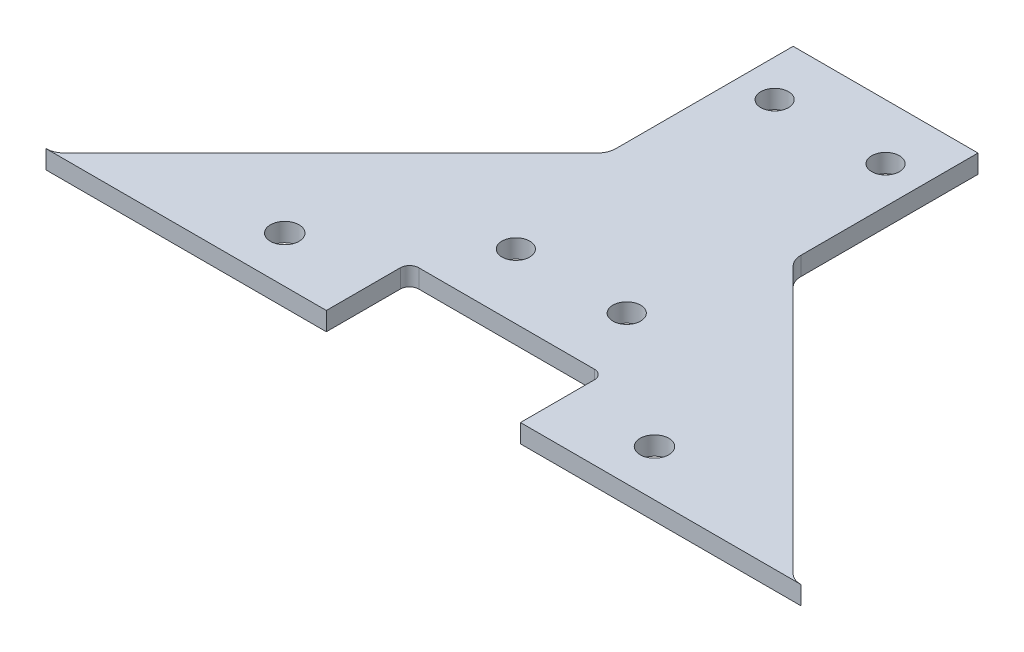
ISO-10303-21;
HEADER;
FILE_DESCRIPTION(('STEP AP214'),'2;1');
FILE_NAME('part.step','',(''),(''),'','','');
FILE_SCHEMA(('AUTOMOTIVE_DESIGN { 1 0 10303 214 1 1 1 1 }'));
ENDSEC;
DATA;
#1=APPLICATION_CONTEXT('core data for automotive mechanical design processes');
#2=APPLICATION_PROTOCOL_DEFINITION('international standard','automotive_design',2000,#1);
#3=PRODUCT_CONTEXT('',#1,'mechanical');
#4=PRODUCT('Part','Part','',(#3));
#5=PRODUCT_RELATED_PRODUCT_CATEGORY('part','',(#4));
#6=PRODUCT_DEFINITION_FORMATION('','',#4);
#7=PRODUCT_DEFINITION_CONTEXT('part definition',#1,'design');
#8=PRODUCT_DEFINITION('design','',#6,#7);
#9=PRODUCT_DEFINITION_SHAPE('','',#8);
#10=(LENGTH_UNIT() NAMED_UNIT(*) SI_UNIT(.MILLI.,.METRE.));
#11=(NAMED_UNIT(*) PLANE_ANGLE_UNIT() SI_UNIT($,.RADIAN.));
#12=(NAMED_UNIT(*) SI_UNIT($,.STERADIAN.) SOLID_ANGLE_UNIT());
#13=UNCERTAINTY_MEASURE_WITH_UNIT(LENGTH_MEASURE(1.E-05),#10,'distance_accuracy_value','');
#14=(GEOMETRIC_REPRESENTATION_CONTEXT(3) GLOBAL_UNCERTAINTY_ASSIGNED_CONTEXT((#13)) GLOBAL_UNIT_ASSIGNED_CONTEXT((#10,
#11,#12)) REPRESENTATION_CONTEXT('',''));
#15=CARTESIAN_POINT('',(0.,0.,0.));
#16=DIRECTION('',(0.,0.,1.));
#17=DIRECTION('',(1.,0.,0.));
#18=AXIS2_PLACEMENT_3D('',#15,#16,#17);
#19=CARTESIAN_POINT('',(0.,0.,50.));
#20=DIRECTION('',(0.,0.,-1.));
#21=DIRECTION('',(-1.,0.,0.));
#22=AXIS2_PLACEMENT_3D('',#19,#20,#21);
#23=PLANE('',#22);
#24=DIRECTION('',(-1.,0.,0.));
#25=VECTOR('',#24,1.);
#26=CARTESIAN_POINT('',(0.,0.,50.));
#27=LINE('',#26,#25);
#28=CARTESIAN_POINT('',(40.8284271247462,0.,50.));
#29=VERTEX_POINT('',#28);
#30=CARTESIAN_POINT('',(10.5,0.,50.));
#31=VERTEX_POINT('',#30);
#32=EDGE_CURVE('E161',#29,#31,#27,.T.);
#33=ORIENTED_EDGE('',*,*,#32,.F.);
#34=DIRECTION('',(0.,-1.,0.));
#35=VECTOR('',#34,1.);
#36=CARTESIAN_POINT('',(40.8284271247462,2.,50.));
#37=LINE('',#36,#35);
#38=CARTESIAN_POINT('',(40.8284271247462,2.,50.));
#39=VERTEX_POINT('',#38);
#40=EDGE_CURVE('E52',#29,#39,#37,.F.);
#41=ORIENTED_EDGE('',*,*,#40,.T.);
#42=DIRECTION('',(-1.,0.,0.));
#43=VECTOR('',#42,1.);
#44=CARTESIAN_POINT('',(0.,2.,50.));
#45=LINE('',#44,#43);
#46=CARTESIAN_POINT('',(10.5,2.,50.));
#47=VERTEX_POINT('',#46);
#48=EDGE_CURVE('E163',#39,#47,#45,.T.);
#49=ORIENTED_EDGE('',*,*,#48,.T.);
#50=DIRECTION('',(0.,1.,0.));
#51=VECTOR('',#50,1.);
#52=CARTESIAN_POINT('',(10.5,0.,50.));
#53=LINE('',#52,#51);
#54=EDGE_CURVE('E158',#31,#47,#53,.T.);
#55=ORIENTED_EDGE('',*,*,#54,.F.);
#56=EDGE_LOOP('',(#33,#41,#49,#55));
#57=FACE_BOUND('',#56,.T.);
#58=ADVANCED_FACE('F43',(#57),#23,.F.);
#59=DIRECTION('',(0.,1.,0.));
#60=VECTOR('',#59,1.);
#61=CARTESIAN_POINT('',(-10.5,0.,50.));
#62=LINE('',#61,#60);
#63=CARTESIAN_POINT('',(-10.5,0.,50.));
#64=VERTEX_POINT('',#63);
#65=CARTESIAN_POINT('',(-10.5,2.,50.));
#66=VERTEX_POINT('',#65);
#67=EDGE_CURVE('E11',#64,#66,#62,.T.);
#68=ORIENTED_EDGE('',*,*,#67,.T.);
#69=CARTESIAN_POINT('',(-40.8284271247462,2.,50.));
#70=VERTEX_POINT('',#69);
#71=EDGE_CURVE('E47',#66,#70,#45,.T.);
#72=ORIENTED_EDGE('',*,*,#71,.T.);
#73=DIRECTION('',(0.,-1.,0.));
#74=VECTOR('',#73,1.);
#75=CARTESIAN_POINT('',(-40.8284271247462,0.,50.));
#76=LINE('',#75,#74);
#77=CARTESIAN_POINT('',(-40.8284271247462,0.,50.));
#78=VERTEX_POINT('',#77);
#79=EDGE_CURVE('E281',#70,#78,#76,.T.);
#80=ORIENTED_EDGE('',*,*,#79,.T.);
#81=EDGE_CURVE('E65',#64,#78,#27,.T.);
#82=ORIENTED_EDGE('',*,*,#81,.F.);
#83=EDGE_LOOP('',(#68,#72,#80,#82));
#84=FACE_BOUND('',#83,.T.);
#85=ADVANCED_FACE('F45',(#84),#23,.F.);
#86=CARTESIAN_POINT('',(6.,0.,6.));
#87=DIRECTION('',(0.,1.,0.));
#88=DIRECTION('',(0.,0.,1.));
#89=AXIS2_PLACEMENT_3D('',#86,#87,#88);
#90=CYLINDRICAL_SURFACE('',#89,1.5);
#91=CARTESIAN_POINT('',(6.,0.,6.));
#92=DIRECTION('',(0.,1.,0.));
#93=DIRECTION('',(0.,0.,-1.));
#94=AXIS2_PLACEMENT_3D('',#91,#92,#93);
#95=CIRCLE('',#94,1.5);
#96=CARTESIAN_POINT('',(6.,0.,4.5));
#97=VERTEX_POINT('',#96);
#98=EDGE_CURVE('E219',#97,#97,#95,.T.);
#99=ORIENTED_EDGE('',*,*,#98,.F.);
#100=EDGE_LOOP('',(#99));
#101=FACE_BOUND('',#100,.T.);
#102=CARTESIAN_POINT('',(6.,2.,6.));
#103=DIRECTION('',(0.,1.,0.));
#104=DIRECTION('',(0.,0.,-1.));
#105=AXIS2_PLACEMENT_3D('',#102,#103,#104);
#106=CIRCLE('',#105,1.5);
#107=CARTESIAN_POINT('',(6.,2.,4.5));
#108=VERTEX_POINT('',#107);
#109=EDGE_CURVE('E213',#108,#108,#106,.T.);
#110=ORIENTED_EDGE('',*,*,#109,.T.);
#111=EDGE_LOOP('',(#110));
#112=FACE_BOUND('',#111,.T.);
#113=ADVANCED_FACE('F364',(#101,#112),#90,.F.);
#114=CARTESIAN_POINT('',(6.00000000000001,0.,34.));
#115=DIRECTION('',(0.,1.,0.));
#116=DIRECTION('',(0.,0.,1.));
#117=AXIS2_PLACEMENT_3D('',#114,#115,#116);
#118=CYLINDRICAL_SURFACE('',#117,1.5);
#119=CARTESIAN_POINT('',(6.00000000000001,0.,34.));
#120=DIRECTION('',(0.,1.,0.));
#121=DIRECTION('',(0.,0.,-1.));
#122=AXIS2_PLACEMENT_3D('',#119,#120,#121);
#123=CIRCLE('',#122,1.5);
#124=CARTESIAN_POINT('',(6.00000000000001,0.,32.5));
#125=VERTEX_POINT('',#124);
#126=EDGE_CURVE('E232',#125,#125,#123,.T.);
#127=ORIENTED_EDGE('',*,*,#126,.F.);
#128=EDGE_LOOP('',(#127));
#129=FACE_BOUND('',#128,.T.);
#130=CARTESIAN_POINT('',(6.00000000000001,2.,34.));
#131=DIRECTION('',(0.,1.,0.));
#132=DIRECTION('',(0.,0.,-1.));
#133=AXIS2_PLACEMENT_3D('',#130,#131,#132);
#134=CIRCLE('',#133,1.5);
#135=CARTESIAN_POINT('',(6.00000000000001,2.,32.5));
#136=VERTEX_POINT('',#135);
#137=EDGE_CURVE('E222',#136,#136,#134,.T.);
#138=ORIENTED_EDGE('',*,*,#137,.T.);
#139=EDGE_LOOP('',(#138));
#140=FACE_BOUND('',#139,.T.);
#141=ADVANCED_FACE('F369',(#129,#140),#118,.F.);
#142=CARTESIAN_POINT('',(-6.,0.,34.));
#143=DIRECTION('',(0.,1.,0.));
#144=DIRECTION('',(0.,0.,1.));
#145=AXIS2_PLACEMENT_3D('',#142,#143,#144);
#146=CYLINDRICAL_SURFACE('',#145,1.5);
#147=CARTESIAN_POINT('',(-6.,0.,34.));
#148=DIRECTION('',(0.,1.,0.));
#149=DIRECTION('',(0.,0.,1.));
#150=AXIS2_PLACEMENT_3D('',#147,#148,#149);
#151=CIRCLE('',#150,1.5);
#152=CARTESIAN_POINT('',(-6.,0.,35.5));
#153=VERTEX_POINT('',#152);
#154=EDGE_CURVE('E225',#153,#153,#151,.T.);
#155=ORIENTED_EDGE('',*,*,#154,.F.);
#156=EDGE_LOOP('',(#155));
#157=FACE_BOUND('',#156,.T.);
#158=CARTESIAN_POINT('',(-6.,2.,34.));
#159=DIRECTION('',(0.,1.,0.));
#160=DIRECTION('',(0.,0.,1.));
#161=AXIS2_PLACEMENT_3D('',#158,#159,#160);
#162=CIRCLE('',#161,1.5);
#163=CARTESIAN_POINT('',(-6.,2.,35.5));
#164=VERTEX_POINT('',#163);
#165=EDGE_CURVE('E229',#164,#164,#162,.T.);
#166=ORIENTED_EDGE('',*,*,#165,.T.);
#167=EDGE_LOOP('',(#166));
#168=FACE_BOUND('',#167,.T.);
#169=ADVANCED_FACE('F395',(#157,#168),#146,.F.);
#170=CARTESIAN_POINT('',(12.,2.,19.1715728752541));
#171=DIRECTION('',(0.,1.,0.));
#172=DIRECTION('',(0.,0.,1.));
#173=AXIS2_PLACEMENT_3D('',#170,#171,#172);
#174=CYLINDRICAL_SURFACE('',#173,2.);
#175=CARTESIAN_POINT('',(12.,2.,19.1715728752541));
#176=DIRECTION('',(0.,1.,0.));
#177=DIRECTION('',(0.,0.,1.));
#178=AXIS2_PLACEMENT_3D('',#175,#176,#177);
#179=CIRCLE('',#178,2.);
#180=CARTESIAN_POINT('',(10.5857864376269,2.,20.5857864376272));
#181=VERTEX_POINT('',#180);
#182=CARTESIAN_POINT('',(10.,2.,19.1715728752541));
#183=VERTEX_POINT('',#182);
#184=EDGE_CURVE('E297',#181,#183,#179,.F.);
#185=ORIENTED_EDGE('',*,*,#184,.F.);
#186=DIRECTION('',(0.,-1.,0.));
#187=VECTOR('',#186,1.);
#188=CARTESIAN_POINT('',(10.5857864376269,2.,20.5857864376272));
#189=LINE('',#188,#187);
#190=CARTESIAN_POINT('',(10.5857864376269,0.,20.5857864376272));
#191=VERTEX_POINT('',#190);
#192=EDGE_CURVE('E274',#191,#181,#189,.F.);
#193=ORIENTED_EDGE('',*,*,#192,.F.);
#194=CARTESIAN_POINT('',(12.,0.,19.1715728752541));
#195=DIRECTION('',(0.,1.,0.));
#196=DIRECTION('',(0.,0.,1.));
#197=AXIS2_PLACEMENT_3D('',#194,#195,#196);
#198=CIRCLE('',#197,2.);
#199=CARTESIAN_POINT('',(10.,0.,19.1715728752541));
#200=VERTEX_POINT('',#199);
#201=EDGE_CURVE('E295',#200,#191,#198,.T.);
#202=ORIENTED_EDGE('',*,*,#201,.F.);
#203=DIRECTION('',(0.,-1.,0.));
#204=VECTOR('',#203,1.);
#205=CARTESIAN_POINT('',(10.,0.,19.1715728752541));
#206=LINE('',#205,#204);
#207=EDGE_CURVE('E279',#183,#200,#206,.T.);
#208=ORIENTED_EDGE('',*,*,#207,.F.);
#209=EDGE_LOOP('',(#185,#193,#202,#208));
#210=FACE_BOUND('',#209,.T.);
#211=ADVANCED_FACE('F340',(#210),#174,.F.);
#212=CARTESIAN_POINT('',(10.,2.,0.));
#213=DIRECTION('',(-1.,0.,0.));
#214=DIRECTION('',(0.,0.,1.));
#215=AXIS2_PLACEMENT_3D('',#212,#213,#214);
#216=PLANE('',#215);
#217=DIRECTION('',(0.,0.,-1.));
#218=VECTOR('',#217,1.);
#219=CARTESIAN_POINT('',(10.,2.,0.));
#220=LINE('',#219,#218);
#221=CARTESIAN_POINT('',(10.,2.,0.));
#222=VERTEX_POINT('',#221);
#223=EDGE_CURVE('E246',#183,#222,#220,.T.);
#224=ORIENTED_EDGE('',*,*,#223,.F.);
#225=ORIENTED_EDGE('',*,*,#207,.T.);
#226=DIRECTION('',(0.,0.,-1.));
#227=VECTOR('',#226,1.);
#228=CARTESIAN_POINT('',(10.,0.,0.));
#229=LINE('',#228,#227);
#230=CARTESIAN_POINT('',(10.,0.,0.));
#231=VERTEX_POINT('',#230);
#232=EDGE_CURVE('E260',#200,#231,#229,.T.);
#233=ORIENTED_EDGE('',*,*,#232,.T.);
#234=DIRECTION('',(0.,-1.,0.));
#235=VECTOR('',#234,1.);
#236=CARTESIAN_POINT('',(10.,2.,0.));
#237=LINE('',#236,#235);
#238=EDGE_CURVE('E271',#222,#231,#237,.T.);
#239=ORIENTED_EDGE('',*,*,#238,.F.);
#240=EDGE_LOOP('',(#224,#225,#233,#239));
#241=FACE_BOUND('',#240,.T.);
#242=ADVANCED_FACE('F336',(#241),#216,.F.);
#243=CARTESIAN_POINT('',(10.,2.,0.));
#244=DIRECTION('',(0.,0.,1.));
#245=DIRECTION('',(1.,0.,0.));
#246=AXIS2_PLACEMENT_3D('',#243,#244,#245);
#247=PLANE('',#246);
#248=DIRECTION('',(-1.,0.,0.));
#249=VECTOR('',#248,1.);
#250=CARTESIAN_POINT('',(10.,0.,0.));
#251=LINE('',#250,#249);
#252=CARTESIAN_POINT('',(-10.,0.,0.));
#253=VERTEX_POINT('',#252);
#254=EDGE_CURVE('E262',#231,#253,#251,.T.);
#255=ORIENTED_EDGE('',*,*,#254,.T.);
#256=DIRECTION('',(0.,-1.,0.));
#257=VECTOR('',#256,1.);
#258=CARTESIAN_POINT('',(-10.,2.,0.));
#259=LINE('',#258,#257);
#260=CARTESIAN_POINT('',(-10.,2.,0.));
#261=VERTEX_POINT('',#260);
#262=EDGE_CURVE('E257',#261,#253,#259,.T.);
#263=ORIENTED_EDGE('',*,*,#262,.F.);
#264=DIRECTION('',(-1.,0.,0.));
#265=VECTOR('',#264,1.);
#266=CARTESIAN_POINT('',(10.,2.,0.));
#267=LINE('',#266,#265);
#268=EDGE_CURVE('E249',#222,#261,#267,.T.);
#269=ORIENTED_EDGE('',*,*,#268,.F.);
#270=ORIENTED_EDGE('',*,*,#238,.T.);
#271=EDGE_LOOP('',(#255,#263,#269,#270));
#272=FACE_BOUND('',#271,.T.);
#273=ADVANCED_FACE('F331',(#272),#247,.F.);
#274=CARTESIAN_POINT('',(-10.,2.,0.));
#275=DIRECTION('',(1.,0.,0.));
#276=DIRECTION('',(0.,0.,-1.));
#277=AXIS2_PLACEMENT_3D('',#274,#275,#276);
#278=PLANE('',#277);
#279=DIRECTION('',(0.,0.,1.));
#280=VECTOR('',#279,1.);
#281=CARTESIAN_POINT('',(-10.,0.,0.));
#282=LINE('',#281,#280);
#283=CARTESIAN_POINT('',(-10.,0.,19.1715728752541));
#284=VERTEX_POINT('',#283);
#285=EDGE_CURVE('E264',#253,#284,#282,.T.);
#286=ORIENTED_EDGE('',*,*,#285,.T.);
#287=DIRECTION('',(0.,-1.,0.));
#288=VECTOR('',#287,1.);
#289=CARTESIAN_POINT('',(-10.,2.,19.1715728752541));
#290=LINE('',#289,#288);
#291=CARTESIAN_POINT('',(-10.,2.,19.1715728752541));
#292=VERTEX_POINT('',#291);
#293=EDGE_CURVE('E289',#284,#292,#290,.F.);
#294=ORIENTED_EDGE('',*,*,#293,.T.);
#295=DIRECTION('',(0.,0.,1.));
#296=VECTOR('',#295,1.);
#297=CARTESIAN_POINT('',(-10.,2.,0.));
#298=LINE('',#297,#296);
#299=EDGE_CURVE('E251',#261,#292,#298,.T.);
#300=ORIENTED_EDGE('',*,*,#299,.F.);
#301=ORIENTED_EDGE('',*,*,#262,.T.);
#302=EDGE_LOOP('',(#286,#294,#300,#301));
#303=FACE_BOUND('',#302,.T.);
#304=ADVANCED_FACE('F327',(#303),#278,.F.);
#305=CARTESIAN_POINT('',(-12.,2.,19.1715728752541));
#306=DIRECTION('',(0.,1.,0.));
#307=DIRECTION('',(0.,0.,1.));
#308=AXIS2_PLACEMENT_3D('',#305,#306,#307);
#309=CYLINDRICAL_SURFACE('',#308,2.);
#310=CARTESIAN_POINT('',(-12.,2.,19.1715728752541));
#311=DIRECTION('',(0.,1.,0.));
#312=DIRECTION('',(0.,0.,1.));
#313=AXIS2_PLACEMENT_3D('',#310,#311,#312);
#314=CIRCLE('',#313,2.);
#315=CARTESIAN_POINT('',(-10.5857864376269,2.,20.5857864376272));
#316=VERTEX_POINT('',#315);
#317=EDGE_CURVE('E301',#292,#316,#314,.F.);
#318=ORIENTED_EDGE('',*,*,#317,.F.);
#319=ORIENTED_EDGE('',*,*,#293,.F.);
#320=CARTESIAN_POINT('',(-12.,0.,19.1715728752541));
#321=DIRECTION('',(0.,1.,0.));
#322=DIRECTION('',(0.,0.,1.));
#323=AXIS2_PLACEMENT_3D('',#320,#321,#322);
#324=CIRCLE('',#323,2.);
#325=CARTESIAN_POINT('',(-10.5857864376269,0.,20.5857864376272));
#326=VERTEX_POINT('',#325);
#327=EDGE_CURVE('E299',#326,#284,#324,.T.);
#328=ORIENTED_EDGE('',*,*,#327,.F.);
#329=DIRECTION('',(0.,-1.,0.));
#330=VECTOR('',#329,1.);
#331=CARTESIAN_POINT('',(-10.5857864376269,0.,20.5857864376272));
#332=LINE('',#331,#330);
#333=EDGE_CURVE('E286',#316,#326,#332,.T.);
#334=ORIENTED_EDGE('',*,*,#333,.F.);
#335=EDGE_LOOP('',(#318,#319,#328,#334));
#336=FACE_BOUND('',#335,.T.);
#337=ADVANCED_FACE('F323',(#336),#309,.F.);
#338=CARTESIAN_POINT('',(-9.5,0.,41.));
#339=DIRECTION('',(0.,0.,-1.));
#340=DIRECTION('',(-1.,0.,0.));
#341=AXIS2_PLACEMENT_3D('',#338,#339,#340);
#342=PLANE('',#341);
#343=DIRECTION('',(-1.,0.,0.));
#344=VECTOR('',#343,1.);
#345=CARTESIAN_POINT('',(-9.5,2.,41.));
#346=LINE('',#345,#344);
#347=CARTESIAN_POINT('',(9.49999999999999,2.,41.));
#348=VERTEX_POINT('',#347);
#349=CARTESIAN_POINT('',(-9.50000000000001,2.,41.));
#350=VERTEX_POINT('',#349);
#351=EDGE_CURVE('E206',#348,#350,#346,.T.);
#352=ORIENTED_EDGE('',*,*,#351,.T.);
#353=DIRECTION('',(0.,1.,0.));
#354=VECTOR('',#353,1.);
#355=CARTESIAN_POINT('',(-9.50000000000001,0.,41.));
#356=LINE('',#355,#354);
#357=CARTESIAN_POINT('',(-9.50000000000001,0.,41.));
#358=VERTEX_POINT('',#357);
#359=EDGE_CURVE('E214',#358,#350,#356,.T.);
#360=ORIENTED_EDGE('',*,*,#359,.F.);
#361=DIRECTION('',(-1.,0.,0.));
#362=VECTOR('',#361,1.);
#363=CARTESIAN_POINT('',(-9.5,0.,41.));
#364=LINE('',#363,#362);
#365=CARTESIAN_POINT('',(9.49999999999999,0.,41.));
#366=VERTEX_POINT('',#365);
#367=EDGE_CURVE('E184',#366,#358,#364,.T.);
#368=ORIENTED_EDGE('',*,*,#367,.F.);
#369=DIRECTION('',(0.,1.,0.));
#370=VECTOR('',#369,1.);
#371=CARTESIAN_POINT('',(9.49999999999999,0.,41.));
#372=LINE('',#371,#370);
#373=EDGE_CURVE('E216',#366,#348,#372,.T.);
#374=ORIENTED_EDGE('',*,*,#373,.T.);
#375=EDGE_LOOP('',(#352,#360,#368,#374));
#376=FACE_BOUND('',#375,.T.);
#377=ADVANCED_FACE('F387',(#376),#342,.F.);
#378=CARTESIAN_POINT('',(-6.,0.,6.));
#379=DIRECTION('',(0.,1.,0.));
#380=DIRECTION('',(0.,0.,1.));
#381=AXIS2_PLACEMENT_3D('',#378,#379,#380);
#382=CYLINDRICAL_SURFACE('',#381,1.5);
#383=CARTESIAN_POINT('',(-6.,0.,6.));
#384=DIRECTION('',(0.,1.,0.));
#385=DIRECTION('',(0.,0.,1.));
#386=AXIS2_PLACEMENT_3D('',#383,#384,#385);
#387=CIRCLE('',#386,1.5);
#388=CARTESIAN_POINT('',(-6.,0.,7.5));
#389=VERTEX_POINT('',#388);
#390=EDGE_CURVE('E237',#389,#389,#387,.T.);
#391=ORIENTED_EDGE('',*,*,#390,.F.);
#392=EDGE_LOOP('',(#391));
#393=FACE_BOUND('',#392,.T.);
#394=CARTESIAN_POINT('',(-6.,2.,6.));
#395=DIRECTION('',(0.,1.,0.));
#396=DIRECTION('',(0.,0.,1.));
#397=AXIS2_PLACEMENT_3D('',#394,#395,#396);
#398=CIRCLE('',#397,1.5);
#399=CARTESIAN_POINT('',(-6.,2.,7.5));
#400=VERTEX_POINT('',#399);
#401=EDGE_CURVE('E228',#400,#400,#398,.T.);
#402=ORIENTED_EDGE('',*,*,#401,.T.);
#403=EDGE_LOOP('',(#402));
#404=FACE_BOUND('',#403,.T.);
#405=ADVANCED_FACE('F390',(#393,#404),#382,.F.);
#406=CARTESIAN_POINT('',(20.,0.,45.));
#407=DIRECTION('',(0.,1.,0.));
#408=DIRECTION('',(0.,0.,1.));
#409=AXIS2_PLACEMENT_3D('',#406,#407,#408);
#410=CYLINDRICAL_SURFACE('',#409,1.55);
#411=CARTESIAN_POINT('',(20.,0.,45.));
#412=DIRECTION('',(0.,1.,0.));
#413=DIRECTION('',(0.,0.,-1.));
#414=AXIS2_PLACEMENT_3D('',#411,#412,#413);
#415=CIRCLE('',#414,1.55);
#416=CARTESIAN_POINT('',(20.,0.,43.45));
#417=VERTEX_POINT('',#416);
#418=EDGE_CURVE('E565',#417,#417,#415,.T.);
#419=ORIENTED_EDGE('',*,*,#418,.F.);
#420=EDGE_LOOP('',(#419));
#421=FACE_BOUND('',#420,.T.);
#422=CARTESIAN_POINT('',(20.,2.,45.));
#423=DIRECTION('',(0.,1.,0.));
#424=DIRECTION('',(0.,0.,-1.));
#425=AXIS2_PLACEMENT_3D('',#422,#423,#424);
#426=CIRCLE('',#425,1.55);
#427=CARTESIAN_POINT('',(20.,2.,43.45));
#428=VERTEX_POINT('',#427);
#429=EDGE_CURVE('E190',#428,#428,#426,.T.);
#430=ORIENTED_EDGE('',*,*,#429,.T.);
#431=EDGE_LOOP('',(#430));
#432=FACE_BOUND('',#431,.T.);
#433=ADVANCED_FACE('F379',(#421,#432),#410,.F.);
#434=CARTESIAN_POINT('',(-20.,0.,45.));
#435=DIRECTION('',(0.,1.,0.));
#436=DIRECTION('',(0.,0.,1.));
#437=AXIS2_PLACEMENT_3D('',#434,#435,#436);
#438=CYLINDRICAL_SURFACE('',#437,1.55);
#439=CARTESIAN_POINT('',(-20.,0.,45.));
#440=DIRECTION('',(0.,1.,0.));
#441=DIRECTION('',(0.,0.,1.));
#442=AXIS2_PLACEMENT_3D('',#439,#440,#441);
#443=CIRCLE('',#442,1.55);
#444=CARTESIAN_POINT('',(-20.,0.,46.55));
#445=VERTEX_POINT('',#444);
#446=EDGE_CURVE('E203',#445,#445,#443,.T.);
#447=ORIENTED_EDGE('',*,*,#446,.F.);
#448=EDGE_LOOP('',(#447));
#449=FACE_BOUND('',#448,.T.);
#450=CARTESIAN_POINT('',(-20.,2.,45.));
#451=DIRECTION('',(0.,1.,0.));
#452=DIRECTION('',(0.,0.,1.));
#453=AXIS2_PLACEMENT_3D('',#450,#451,#452);
#454=CIRCLE('',#453,1.55);
#455=CARTESIAN_POINT('',(-20.,2.,46.55));
#456=VERTEX_POINT('',#455);
#457=EDGE_CURVE('E564',#456,#456,#454,.T.);
#458=ORIENTED_EDGE('',*,*,#457,.T.);
#459=EDGE_LOOP('',(#458));
#460=FACE_BOUND('',#459,.T.);
#461=ADVANCED_FACE('F385',(#449,#460),#438,.F.);
#462=CARTESIAN_POINT('',(-9.50000000000001,0.,42.));
#463=DIRECTION('',(0.,1.,0.));
#464=DIRECTION('',(0.,0.,1.));
#465=AXIS2_PLACEMENT_3D('',#462,#463,#464);
#466=CYLINDRICAL_SURFACE('',#465,1.);
#467=CARTESIAN_POINT('',(-9.50000000000001,2.,42.));
#468=DIRECTION('',(0.,1.,0.));
#469=DIRECTION('',(0.,0.,-1.));
#470=AXIS2_PLACEMENT_3D('',#467,#468,#469);
#471=CIRCLE('',#470,1.);
#472=CARTESIAN_POINT('',(-10.5,2.,42.));
#473=VERTEX_POINT('',#472);
#474=EDGE_CURVE('E187',#350,#473,#471,.T.);
#475=ORIENTED_EDGE('',*,*,#474,.T.);
#476=DIRECTION('',(0.,1.,0.));
#477=VECTOR('',#476,1.);
#478=CARTESIAN_POINT('',(-10.5,0.,42.));
#479=LINE('',#478,#477);
#480=CARTESIAN_POINT('',(-10.5,0.,42.));
#481=VERTEX_POINT('',#480);
#482=EDGE_CURVE('E211',#481,#473,#479,.T.);
#483=ORIENTED_EDGE('',*,*,#482,.F.);
#484=CARTESIAN_POINT('',(-9.50000000000001,0.,42.));
#485=DIRECTION('',(0.,1.,0.));
#486=DIRECTION('',(0.,0.,-1.));
#487=AXIS2_PLACEMENT_3D('',#484,#485,#486);
#488=CIRCLE('',#487,1.);
#489=EDGE_CURVE('E195',#358,#481,#488,.T.);
#490=ORIENTED_EDGE('',*,*,#489,.F.);
#491=ORIENTED_EDGE('',*,*,#359,.T.);
#492=EDGE_LOOP('',(#475,#483,#490,#491));
#493=FACE_BOUND('',#492,.T.);
#494=ADVANCED_FACE('F381',(#493),#466,.F.);
#495=CARTESIAN_POINT('',(9.5,0.,42.));
#496=DIRECTION('',(0.,1.,0.));
#497=DIRECTION('',(0.,0.,1.));
#498=AXIS2_PLACEMENT_3D('',#495,#496,#497);
#499=CYLINDRICAL_SURFACE('',#498,1.);
#500=CARTESIAN_POINT('',(9.5,2.,42.));
#501=DIRECTION('',(0.,1.,0.));
#502=DIRECTION('',(0.,0.,-1.));
#503=AXIS2_PLACEMENT_3D('',#500,#501,#502);
#504=CIRCLE('',#503,1.);
#505=CARTESIAN_POINT('',(10.5,2.,42.));
#506=VERTEX_POINT('',#505);
#507=EDGE_CURVE('E202',#506,#348,#504,.T.);
#508=ORIENTED_EDGE('',*,*,#507,.T.);
#509=ORIENTED_EDGE('',*,*,#373,.F.);
#510=CARTESIAN_POINT('',(9.5,0.,42.));
#511=DIRECTION('',(0.,1.,0.));
#512=DIRECTION('',(0.,0.,-1.));
#513=AXIS2_PLACEMENT_3D('',#510,#511,#512);
#514=CIRCLE('',#513,1.);
#515=CARTESIAN_POINT('',(10.5,0.,42.));
#516=VERTEX_POINT('',#515);
#517=EDGE_CURVE('E181',#516,#366,#514,.T.);
#518=ORIENTED_EDGE('',*,*,#517,.F.);
#519=DIRECTION('',(0.,1.,0.));
#520=VECTOR('',#519,1.);
#521=CARTESIAN_POINT('',(10.5,0.,42.));
#522=LINE('',#521,#520);
#523=EDGE_CURVE('E168',#516,#506,#522,.T.);
#524=ORIENTED_EDGE('',*,*,#523,.T.);
#525=EDGE_LOOP('',(#508,#509,#518,#524));
#526=FACE_BOUND('',#525,.T.);
#527=ADVANCED_FACE('F384',(#526),#499,.F.);
#528=CARTESIAN_POINT('',(10.,2.,20.0000000000003));
#529=DIRECTION('',(-0.707106781186544,0.,0.707106781186551));
#530=DIRECTION('',(0.707106781186551,0.,0.707106781186544));
#531=AXIS2_PLACEMENT_3D('',#528,#529,#530);
#532=PLANE('',#531);
#533=DIRECTION('',(-0.707106781186551,0.,-0.707106781186544));
#534=VECTOR('',#533,1.);
#535=CARTESIAN_POINT('',(10.,2.,20.0000000000003));
#536=LINE('',#535,#534);
#537=CARTESIAN_POINT('',(39.4142135623731,2.,49.4142135623731));
#538=VERTEX_POINT('',#537);
#539=EDGE_CURVE('E243',#538,#181,#536,.T.);
#540=ORIENTED_EDGE('',*,*,#539,.F.);
#541=DIRECTION('',(0.,-1.,0.));
#542=VECTOR('',#541,1.);
#543=CARTESIAN_POINT('',(39.4142135623731,0.,49.4142135623731));
#544=LINE('',#543,#542);
#545=CARTESIAN_POINT('',(39.4142135623731,0.,49.4142135623731));
#546=VERTEX_POINT('',#545);
#547=EDGE_CURVE('E276',#538,#546,#544,.T.);
#548=ORIENTED_EDGE('',*,*,#547,.T.);
#549=DIRECTION('',(-0.707106781186551,0.,-0.707106781186544));
#550=VECTOR('',#549,1.);
#551=CARTESIAN_POINT('',(10.,0.,20.0000000000003));
#552=LINE('',#551,#550);
#553=EDGE_CURVE('E240',#546,#191,#552,.T.);
#554=ORIENTED_EDGE('',*,*,#553,.T.);
#555=ORIENTED_EDGE('',*,*,#192,.T.);
#556=EDGE_LOOP('',(#540,#548,#554,#555));
#557=FACE_BOUND('',#556,.T.);
#558=ADVANCED_FACE('F344',(#557),#532,.F.);
#559=CARTESIAN_POINT('',(0.,0.,0.));
#560=DIRECTION('',(0.,1.,0.));
#561=DIRECTION('',(0.,0.,1.));
#562=AXIS2_PLACEMENT_3D('',#559,#560,#561);
#563=PLANE('',#562);
#564=ORIENTED_EDGE('',*,*,#446,.T.);
#565=EDGE_LOOP('',(#564));
#566=FACE_BOUND('',#565,.T.);
#567=ORIENTED_EDGE('',*,*,#418,.T.);
#568=EDGE_LOOP('',(#567));
#569=FACE_BOUND('',#568,.T.);
#570=ORIENTED_EDGE('',*,*,#390,.T.);
#571=EDGE_LOOP('',(#570));
#572=FACE_BOUND('',#571,.T.);
#573=CARTESIAN_POINT('',(40.8284271247462,0.,48.));
#574=DIRECTION('',(0.,1.,0.));
#575=DIRECTION('',(0.,0.,1.));
#576=AXIS2_PLACEMENT_3D('',#573,#574,#575);
#577=CIRCLE('',#576,2.);
#578=EDGE_CURVE('E178',#546,#29,#577,.T.);
#579=ORIENTED_EDGE('',*,*,#578,.T.);
#580=ORIENTED_EDGE('',*,*,#32,.T.);
#581=DIRECTION('',(0.,0.,-1.));
#582=VECTOR('',#581,1.);
#583=CARTESIAN_POINT('',(10.5,0.,50.));
#584=LINE('',#583,#582);
#585=EDGE_CURVE('E176',#31,#516,#584,.T.);
#586=ORIENTED_EDGE('',*,*,#585,.T.);
#587=ORIENTED_EDGE('',*,*,#517,.T.);
#588=ORIENTED_EDGE('',*,*,#367,.T.);
#589=ORIENTED_EDGE('',*,*,#489,.T.);
#590=DIRECTION('',(0.,0.,1.));
#591=VECTOR('',#590,1.);
#592=CARTESIAN_POINT('',(-10.5,0.,50.));
#593=LINE('',#592,#591);
#594=EDGE_CURVE('E169',#481,#64,#593,.T.);
#595=ORIENTED_EDGE('',*,*,#594,.T.);
#596=ORIENTED_EDGE('',*,*,#81,.T.);
#597=CARTESIAN_POINT('',(-40.8284271247462,0.,48.));
#598=DIRECTION('',(0.,1.,0.));
#599=DIRECTION('',(0.,0.,1.));
#600=AXIS2_PLACEMENT_3D('',#597,#598,#599);
#601=CIRCLE('',#600,2.);
#602=CARTESIAN_POINT('',(-39.4142135623731,0.,49.4142135623731));
#603=VERTEX_POINT('',#602);
#604=EDGE_CURVE('E303',#78,#603,#601,.T.);
#605=ORIENTED_EDGE('',*,*,#604,.T.);
#606=DIRECTION('',(-0.707106781186551,0.,0.707106781186544));
#607=VECTOR('',#606,1.);
#608=CARTESIAN_POINT('',(-10.,0.,20.0000000000003));
#609=LINE('',#608,#607);
#610=EDGE_CURVE('E247',#326,#603,#609,.T.);
#611=ORIENTED_EDGE('',*,*,#610,.F.);
#612=ORIENTED_EDGE('',*,*,#327,.T.);
#613=ORIENTED_EDGE('',*,*,#285,.F.);
#614=ORIENTED_EDGE('',*,*,#254,.F.);
#615=ORIENTED_EDGE('',*,*,#232,.F.);
#616=ORIENTED_EDGE('',*,*,#201,.T.);
#617=ORIENTED_EDGE('',*,*,#553,.F.);
#618=EDGE_LOOP('',(#579,#580,#586,#587,#588,#589,#595,#596,#605,#611,#612,#613,#614,#615,#616,#617));
#619=FACE_BOUND('',#618,.T.);
#620=ORIENTED_EDGE('',*,*,#154,.T.);
#621=EDGE_LOOP('',(#620));
#622=FACE_BOUND('',#621,.T.);
#623=ORIENTED_EDGE('',*,*,#126,.T.);
#624=EDGE_LOOP('',(#623));
#625=FACE_BOUND('',#624,.T.);
#626=ORIENTED_EDGE('',*,*,#98,.T.);
#627=EDGE_LOOP('',(#626));
#628=FACE_BOUND('',#627,.T.);
#629=ADVANCED_FACE('F173',(#566,#569,#572,#619,#622,#625,#628),#563,.F.);
#630=CARTESIAN_POINT('',(-10.,2.,20.0000000000003));
#631=DIRECTION('',(0.707106781186544,0.,0.707106781186551));
#632=DIRECTION('',(0.707106781186551,0.,-0.707106781186544));
#633=AXIS2_PLACEMENT_3D('',#630,#631,#632);
#634=PLANE('',#633);
#635=DIRECTION('',(-0.707106781186551,0.,0.707106781186544));
#636=VECTOR('',#635,1.);
#637=CARTESIAN_POINT('',(-10.,2.,20.0000000000003));
#638=LINE('',#637,#636);
#639=CARTESIAN_POINT('',(-39.4142135623731,2.,49.4142135623731));
#640=VERTEX_POINT('',#639);
#641=EDGE_CURVE('E254',#316,#640,#638,.T.);
#642=ORIENTED_EDGE('',*,*,#641,.F.);
#643=ORIENTED_EDGE('',*,*,#333,.T.);
#644=ORIENTED_EDGE('',*,*,#610,.T.);
#645=DIRECTION('',(0.,-1.,0.));
#646=VECTOR('',#645,1.);
#647=CARTESIAN_POINT('',(-39.4142135623731,2.,49.4142135623731));
#648=LINE('',#647,#646);
#649=EDGE_CURVE('E284',#603,#640,#648,.F.);
#650=ORIENTED_EDGE('',*,*,#649,.T.);
#651=EDGE_LOOP('',(#642,#643,#644,#650));
#652=FACE_BOUND('',#651,.T.);
#653=ADVANCED_FACE('F315',(#652),#634,.F.);
#654=CARTESIAN_POINT('',(0.,2.,0.));
#655=DIRECTION('',(0.,1.,0.));
#656=DIRECTION('',(0.,0.,1.));
#657=AXIS2_PLACEMENT_3D('',#654,#655,#656);
#658=PLANE('',#657);
#659=ORIENTED_EDGE('',*,*,#48,.F.);
#660=CARTESIAN_POINT('',(40.8284271247462,2.,48.));
#661=DIRECTION('',(0.,1.,0.));
#662=DIRECTION('',(0.,0.,1.));
#663=AXIS2_PLACEMENT_3D('',#660,#661,#662);
#664=CIRCLE('',#663,2.);
#665=EDGE_CURVE('E293',#39,#538,#664,.F.);
#666=ORIENTED_EDGE('',*,*,#665,.T.);
#667=ORIENTED_EDGE('',*,*,#539,.T.);
#668=ORIENTED_EDGE('',*,*,#184,.T.);
#669=ORIENTED_EDGE('',*,*,#223,.T.);
#670=ORIENTED_EDGE('',*,*,#268,.T.);
#671=ORIENTED_EDGE('',*,*,#299,.T.);
#672=ORIENTED_EDGE('',*,*,#317,.T.);
#673=ORIENTED_EDGE('',*,*,#641,.T.);
#674=CARTESIAN_POINT('',(-40.8284271247462,2.,48.));
#675=DIRECTION('',(0.,1.,0.));
#676=DIRECTION('',(0.,0.,1.));
#677=AXIS2_PLACEMENT_3D('',#674,#675,#676);
#678=CIRCLE('',#677,2.);
#679=EDGE_CURVE('E305',#640,#70,#678,.F.);
#680=ORIENTED_EDGE('',*,*,#679,.T.);
#681=ORIENTED_EDGE('',*,*,#71,.F.);
#682=DIRECTION('',(0.,0.,1.));
#683=VECTOR('',#682,1.);
#684=CARTESIAN_POINT('',(-10.5,2.,50.));
#685=LINE('',#684,#683);
#686=EDGE_CURVE('E182',#473,#66,#685,.T.);
#687=ORIENTED_EDGE('',*,*,#686,.F.);
#688=ORIENTED_EDGE('',*,*,#474,.F.);
#689=ORIENTED_EDGE('',*,*,#351,.F.);
#690=ORIENTED_EDGE('',*,*,#507,.F.);
#691=DIRECTION('',(0.,0.,-1.));
#692=VECTOR('',#691,1.);
#693=CARTESIAN_POINT('',(10.5,2.,50.));
#694=LINE('',#693,#692);
#695=EDGE_CURVE('E200',#47,#506,#694,.T.);
#696=ORIENTED_EDGE('',*,*,#695,.F.);
#697=EDGE_LOOP('',(#659,#666,#667,#668,#669,#670,#671,#672,#673,#680,#681,#687,#688,#689,#690,#696));
#698=FACE_BOUND('',#697,.T.);
#699=ORIENTED_EDGE('',*,*,#457,.F.);
#700=EDGE_LOOP('',(#699));
#701=FACE_BOUND('',#700,.T.);
#702=ORIENTED_EDGE('',*,*,#429,.F.);
#703=EDGE_LOOP('',(#702));
#704=FACE_BOUND('',#703,.T.);
#705=ORIENTED_EDGE('',*,*,#401,.F.);
#706=EDGE_LOOP('',(#705));
#707=FACE_BOUND('',#706,.T.);
#708=ORIENTED_EDGE('',*,*,#165,.F.);
#709=EDGE_LOOP('',(#708));
#710=FACE_BOUND('',#709,.T.);
#711=ORIENTED_EDGE('',*,*,#137,.F.);
#712=EDGE_LOOP('',(#711));
#713=FACE_BOUND('',#712,.T.);
#714=ORIENTED_EDGE('',*,*,#109,.F.);
#715=EDGE_LOOP('',(#714));
#716=FACE_BOUND('',#715,.T.);
#717=ADVANCED_FACE('F317',(#698,#701,#704,#707,#710,#713,#716),#658,.T.);
#718=CARTESIAN_POINT('',(-40.8284271247462,2.,48.));
#719=DIRECTION('',(0.,1.,0.));
#720=DIRECTION('',(0.,0.,1.));
#721=AXIS2_PLACEMENT_3D('',#718,#719,#720);
#722=CYLINDRICAL_SURFACE('',#721,2.);
#723=ORIENTED_EDGE('',*,*,#679,.F.);
#724=ORIENTED_EDGE('',*,*,#649,.F.);
#725=ORIENTED_EDGE('',*,*,#604,.F.);
#726=ORIENTED_EDGE('',*,*,#79,.F.);
#727=EDGE_LOOP('',(#723,#724,#725,#726));
#728=FACE_BOUND('',#727,.T.);
#729=ADVANCED_FACE('F312',(#728),#722,.F.);
#730=CARTESIAN_POINT('',(40.8284271247462,2.,48.));
#731=DIRECTION('',(0.,1.,0.));
#732=DIRECTION('',(0.,0.,1.));
#733=AXIS2_PLACEMENT_3D('',#730,#731,#732);
#734=CYLINDRICAL_SURFACE('',#733,2.);
#735=ORIENTED_EDGE('',*,*,#665,.F.);
#736=ORIENTED_EDGE('',*,*,#40,.F.);
#737=ORIENTED_EDGE('',*,*,#578,.F.);
#738=ORIENTED_EDGE('',*,*,#547,.F.);
#739=EDGE_LOOP('',(#735,#736,#737,#738));
#740=FACE_BOUND('',#739,.T.);
#741=ADVANCED_FACE('F348',(#740),#734,.F.);
#742=CARTESIAN_POINT('',(10.5,0.,50.));
#743=DIRECTION('',(1.,0.,0.));
#744=DIRECTION('',(0.,0.,-1.));
#745=AXIS2_PLACEMENT_3D('',#742,#743,#744);
#746=PLANE('',#745);
#747=ORIENTED_EDGE('',*,*,#695,.T.);
#748=ORIENTED_EDGE('',*,*,#523,.F.);
#749=ORIENTED_EDGE('',*,*,#585,.F.);
#750=ORIENTED_EDGE('',*,*,#54,.T.);
#751=EDGE_LOOP('',(#747,#748,#749,#750));
#752=FACE_BOUND('',#751,.T.);
#753=ADVANCED_FACE('F180',(#752),#746,.F.);
#754=CARTESIAN_POINT('',(-10.5,0.,50.));
#755=DIRECTION('',(-1.,0.,0.));
#756=DIRECTION('',(0.,0.,1.));
#757=AXIS2_PLACEMENT_3D('',#754,#755,#756);
#758=PLANE('',#757);
#759=ORIENTED_EDGE('',*,*,#686,.T.);
#760=ORIENTED_EDGE('',*,*,#67,.F.);
#761=ORIENTED_EDGE('',*,*,#594,.F.);
#762=ORIENTED_EDGE('',*,*,#482,.T.);
#763=EDGE_LOOP('',(#759,#760,#761,#762));
#764=FACE_BOUND('',#763,.T.);
#765=ADVANCED_FACE('F355',(#764),#758,.F.);
#766=CLOSED_SHELL('',(#58,#85,#113,#141,#169,#211,#242,#273,#304,#337,#377,#405,#433,#461,#494,
#527,#558,#629,#653,#717,#729,#741,#753,#765));
#767=MANIFOLD_SOLID_BREP('B2',#766);
#768=ADVANCED_BREP_SHAPE_REPRESENTATION('',(#18,#767),#14);
#769=SHAPE_DEFINITION_REPRESENTATION(#9,#768);
ENDSEC;
END-ISO-10303-21;
